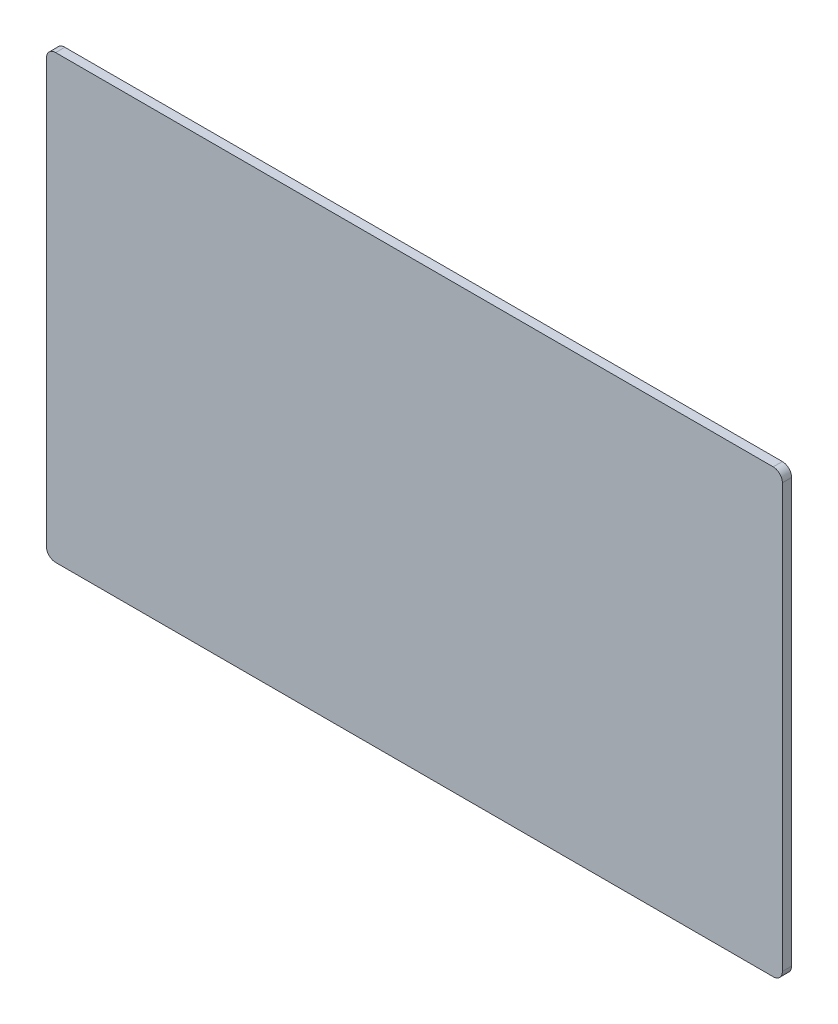
ISO-10303-21;
HEADER;
FILE_DESCRIPTION(('STEP AP214'),'2;1');
FILE_NAME('part.step','',(''),(''),'','','');
FILE_SCHEMA(('AUTOMOTIVE_DESIGN { 1 0 10303 214 1 1 1 1 }'));
ENDSEC;
DATA;
#1=APPLICATION_CONTEXT('core data for automotive mechanical design processes');
#2=APPLICATION_PROTOCOL_DEFINITION('international standard','automotive_design',2000,#1);
#3=PRODUCT_CONTEXT('',#1,'mechanical');
#4=PRODUCT('Part','Part','',(#3));
#5=PRODUCT_RELATED_PRODUCT_CATEGORY('part','',(#4));
#6=PRODUCT_DEFINITION_FORMATION('','',#4);
#7=PRODUCT_DEFINITION_CONTEXT('part definition',#1,'design');
#8=PRODUCT_DEFINITION('design','',#6,#7);
#9=PRODUCT_DEFINITION_SHAPE('','',#8);
#10=(LENGTH_UNIT() NAMED_UNIT(*) SI_UNIT(.MILLI.,.METRE.));
#11=(NAMED_UNIT(*) PLANE_ANGLE_UNIT() SI_UNIT($,.RADIAN.));
#12=(NAMED_UNIT(*) SI_UNIT($,.STERADIAN.) SOLID_ANGLE_UNIT());
#13=UNCERTAINTY_MEASURE_WITH_UNIT(LENGTH_MEASURE(1.E-05),#10,'distance_accuracy_value','');
#14=(GEOMETRIC_REPRESENTATION_CONTEXT(3) GLOBAL_UNCERTAINTY_ASSIGNED_CONTEXT((#13)) GLOBAL_UNIT_ASSIGNED_CONTEXT((#10,
#11,#12)) REPRESENTATION_CONTEXT('',''));
#15=CARTESIAN_POINT('',(0.,0.,0.));
#16=DIRECTION('',(0.,0.,1.));
#17=DIRECTION('',(1.,0.,0.));
#18=AXIS2_PLACEMENT_3D('',#15,#16,#17);
#19=CARTESIAN_POINT('',(0.,0.,6.35));
#20=DIRECTION('',(1.,0.,0.));
#21=DIRECTION('',(0.,0.,-1.));
#22=AXIS2_PLACEMENT_3D('',#19,#20,#21);
#23=PLANE('',#22);
#24=DIRECTION('',(0.,-1.,0.));
#25=VECTOR('',#24,1.);
#26=CARTESIAN_POINT('',(0.,0.,6.35));
#27=LINE('',#26,#25);
#28=CARTESIAN_POINT('',(0.,298.45,6.35));
#29=VERTEX_POINT('',#28);
#30=CARTESIAN_POINT('',(0.,6.35,6.35));
#31=VERTEX_POINT('',#30);
#32=EDGE_CURVE('E128',#29,#31,#27,.T.);
#33=ORIENTED_EDGE('',*,*,#32,.F.);
#34=DIRECTION('',(0.,0.,-1.));
#35=VECTOR('',#34,1.);
#36=CARTESIAN_POINT('',(0.,298.45,6.35));
#37=LINE('',#36,#35);
#38=CARTESIAN_POINT('',(0.,298.45,0.));
#39=VERTEX_POINT('',#38);
#40=EDGE_CURVE('E113',#29,#39,#37,.T.);
#41=ORIENTED_EDGE('',*,*,#40,.T.);
#42=DIRECTION('',(0.,-1.,0.));
#43=VECTOR('',#42,1.);
#44=CARTESIAN_POINT('',(0.,0.,0.));
#45=LINE('',#44,#43);
#46=CARTESIAN_POINT('',(0.,6.35,0.));
#47=VERTEX_POINT('',#46);
#48=EDGE_CURVE('E125',#39,#47,#45,.T.);
#49=ORIENTED_EDGE('',*,*,#48,.T.);
#50=DIRECTION('',(0.,0.,-1.));
#51=VECTOR('',#50,1.);
#52=CARTESIAN_POINT('',(0.,6.35,6.35));
#53=LINE('',#52,#51);
#54=EDGE_CURVE('E130',#47,#31,#53,.F.);
#55=ORIENTED_EDGE('',*,*,#54,.T.);
#56=EDGE_LOOP('',(#33,#41,#49,#55));
#57=FACE_BOUND('',#56,.T.);
#58=ADVANCED_FACE('F43',(#57),#23,.F.);
#59=CARTESIAN_POINT('',(0.,0.,6.35));
#60=DIRECTION('',(0.,1.,0.));
#61=DIRECTION('',(0.,0.,1.));
#62=AXIS2_PLACEMENT_3D('',#59,#60,#61);
#63=PLANE('',#62);
#64=DIRECTION('',(1.,0.,0.));
#65=VECTOR('',#64,1.);
#66=CARTESIAN_POINT('',(0.,0.,0.));
#67=LINE('',#66,#65);
#68=CARTESIAN_POINT('',(6.35,0.,0.));
#69=VERTEX_POINT('',#68);
#70=CARTESIAN_POINT('',(501.65,0.,0.));
#71=VERTEX_POINT('',#70);
#72=EDGE_CURVE('E135',#69,#71,#67,.T.);
#73=ORIENTED_EDGE('',*,*,#72,.T.);
#74=DIRECTION('',(0.,0.,-1.));
#75=VECTOR('',#74,1.);
#76=CARTESIAN_POINT('',(501.65,0.,6.35));
#77=LINE('',#76,#75);
#78=CARTESIAN_POINT('',(501.65,0.,6.35));
#79=VERTEX_POINT('',#78);
#80=EDGE_CURVE('E11',#71,#79,#77,.F.);
#81=ORIENTED_EDGE('',*,*,#80,.T.);
#82=DIRECTION('',(1.,0.,0.));
#83=VECTOR('',#82,1.);
#84=CARTESIAN_POINT('',(0.,0.,6.35));
#85=LINE('',#84,#83);
#86=CARTESIAN_POINT('',(6.35,0.,6.35));
#87=VERTEX_POINT('',#86);
#88=EDGE_CURVE('E170',#87,#79,#85,.T.);
#89=ORIENTED_EDGE('',*,*,#88,.F.);
#90=DIRECTION('',(0.,0.,-1.));
#91=VECTOR('',#90,1.);
#92=CARTESIAN_POINT('',(6.35,0.,6.35));
#93=LINE('',#92,#91);
#94=EDGE_CURVE('E51',#87,#69,#93,.T.);
#95=ORIENTED_EDGE('',*,*,#94,.T.);
#96=EDGE_LOOP('',(#73,#81,#89,#95));
#97=FACE_BOUND('',#96,.T.);
#98=ADVANCED_FACE('F168',(#97),#63,.F.);
#99=CARTESIAN_POINT('',(508.,0.,6.35));
#100=DIRECTION('',(-1.,0.,0.));
#101=DIRECTION('',(0.,0.,1.));
#102=AXIS2_PLACEMENT_3D('',#99,#100,#101);
#103=PLANE('',#102);
#104=DIRECTION('',(0.,1.,0.));
#105=VECTOR('',#104,1.);
#106=CARTESIAN_POINT('',(508.,0.,6.35));
#107=LINE('',#106,#105);
#108=CARTESIAN_POINT('',(508.,6.35,6.35));
#109=VERTEX_POINT('',#108);
#110=CARTESIAN_POINT('',(508.,298.45,6.35));
#111=VERTEX_POINT('',#110);
#112=EDGE_CURVE('E178',#109,#111,#107,.T.);
#113=ORIENTED_EDGE('',*,*,#112,.F.);
#114=DIRECTION('',(0.,0.,-1.));
#115=VECTOR('',#114,1.);
#116=CARTESIAN_POINT('',(508.,6.35,6.35));
#117=LINE('',#116,#115);
#118=CARTESIAN_POINT('',(508.,6.35,0.));
#119=VERTEX_POINT('',#118);
#120=EDGE_CURVE('E162',#109,#119,#117,.T.);
#121=ORIENTED_EDGE('',*,*,#120,.T.);
#122=DIRECTION('',(0.,1.,0.));
#123=VECTOR('',#122,1.);
#124=CARTESIAN_POINT('',(508.,0.,0.));
#125=LINE('',#124,#123);
#126=CARTESIAN_POINT('',(508.,298.45,0.));
#127=VERTEX_POINT('',#126);
#128=EDGE_CURVE('E138',#119,#127,#125,.T.);
#129=ORIENTED_EDGE('',*,*,#128,.T.);
#130=DIRECTION('',(0.,0.,-1.));
#131=VECTOR('',#130,1.);
#132=CARTESIAN_POINT('',(508.,298.45,6.35));
#133=LINE('',#132,#131);
#134=EDGE_CURVE('E58',#127,#111,#133,.F.);
#135=ORIENTED_EDGE('',*,*,#134,.T.);
#136=EDGE_LOOP('',(#113,#121,#129,#135));
#137=FACE_BOUND('',#136,.T.);
#138=ADVANCED_FACE('F177',(#137),#103,.F.);
#139=CARTESIAN_POINT('',(0.,304.8,6.35));
#140=DIRECTION('',(0.,-1.,0.));
#141=DIRECTION('',(0.,0.,-1.));
#142=AXIS2_PLACEMENT_3D('',#139,#140,#141);
#143=PLANE('',#142);
#144=DIRECTION('',(-1.,0.,0.));
#145=VECTOR('',#144,1.);
#146=CARTESIAN_POINT('',(0.,304.8,0.));
#147=LINE('',#146,#145);
#148=CARTESIAN_POINT('',(501.65,304.8,0.));
#149=VERTEX_POINT('',#148);
#150=CARTESIAN_POINT('',(6.35,304.8,0.));
#151=VERTEX_POINT('',#150);
#152=EDGE_CURVE('E145',#149,#151,#147,.T.);
#153=ORIENTED_EDGE('',*,*,#152,.T.);
#154=DIRECTION('',(0.,0.,-1.));
#155=VECTOR('',#154,1.);
#156=CARTESIAN_POINT('',(6.35,304.8,6.35));
#157=LINE('',#156,#155);
#158=CARTESIAN_POINT('',(6.35,304.8,6.35));
#159=VERTEX_POINT('',#158);
#160=EDGE_CURVE('E114',#151,#159,#157,.F.);
#161=ORIENTED_EDGE('',*,*,#160,.T.);
#162=DIRECTION('',(-1.,0.,0.));
#163=VECTOR('',#162,1.);
#164=CARTESIAN_POINT('',(0.,304.8,6.35));
#165=LINE('',#164,#163);
#166=CARTESIAN_POINT('',(501.65,304.8,6.35));
#167=VERTEX_POINT('',#166);
#168=EDGE_CURVE('E141',#167,#159,#165,.T.);
#169=ORIENTED_EDGE('',*,*,#168,.F.);
#170=DIRECTION('',(0.,0.,-1.));
#171=VECTOR('',#170,1.);
#172=CARTESIAN_POINT('',(501.65,304.8,6.35));
#173=LINE('',#172,#171);
#174=EDGE_CURVE('E119',#167,#149,#173,.T.);
#175=ORIENTED_EDGE('',*,*,#174,.T.);
#176=EDGE_LOOP('',(#153,#161,#169,#175));
#177=FACE_BOUND('',#176,.T.);
#178=ADVANCED_FACE('F208',(#177),#143,.F.);
#179=CARTESIAN_POINT('',(0.,0.,6.35));
#180=DIRECTION('',(0.,0.,-1.));
#181=DIRECTION('',(-1.,0.,0.));
#182=AXIS2_PLACEMENT_3D('',#179,#180,#181);
#183=PLANE('',#182);
#184=ORIENTED_EDGE('',*,*,#168,.T.);
#185=CARTESIAN_POINT('',(6.35,298.45,6.35));
#186=DIRECTION('',(0.,0.,-1.));
#187=DIRECTION('',(-1.,0.,0.));
#188=AXIS2_PLACEMENT_3D('',#185,#186,#187);
#189=CIRCLE('',#188,6.35);
#190=EDGE_CURVE('E159',#159,#29,#189,.F.);
#191=ORIENTED_EDGE('',*,*,#190,.T.);
#192=ORIENTED_EDGE('',*,*,#32,.T.);
#193=CARTESIAN_POINT('',(6.35,6.35,6.35));
#194=DIRECTION('',(0.,0.,-1.));
#195=DIRECTION('',(-1.,0.,0.));
#196=AXIS2_PLACEMENT_3D('',#193,#194,#195);
#197=CIRCLE('',#196,6.35);
#198=EDGE_CURVE('E156',#31,#87,#197,.F.);
#199=ORIENTED_EDGE('',*,*,#198,.T.);
#200=ORIENTED_EDGE('',*,*,#88,.T.);
#201=CARTESIAN_POINT('',(501.65,6.35,6.35));
#202=DIRECTION('',(0.,0.,-1.));
#203=DIRECTION('',(-1.,0.,0.));
#204=AXIS2_PLACEMENT_3D('',#201,#202,#203);
#205=CIRCLE('',#204,6.35);
#206=EDGE_CURVE('E65',#79,#109,#205,.F.);
#207=ORIENTED_EDGE('',*,*,#206,.T.);
#208=ORIENTED_EDGE('',*,*,#112,.T.);
#209=CARTESIAN_POINT('',(501.65,298.45,6.35));
#210=DIRECTION('',(0.,0.,-1.));
#211=DIRECTION('',(-1.,0.,0.));
#212=AXIS2_PLACEMENT_3D('',#209,#210,#211);
#213=CIRCLE('',#212,6.35);
#214=EDGE_CURVE('E154',#111,#167,#213,.F.);
#215=ORIENTED_EDGE('',*,*,#214,.T.);
#216=EDGE_LOOP('',(#184,#191,#192,#199,#200,#207,#208,#215));
#217=FACE_BOUND('',#216,.T.);
#218=ADVANCED_FACE('F183',(#217),#183,.F.);
#219=CARTESIAN_POINT('',(0.,0.,0.));
#220=DIRECTION('',(0.,0.,-1.));
#221=DIRECTION('',(-1.,0.,0.));
#222=AXIS2_PLACEMENT_3D('',#219,#220,#221);
#223=PLANE('',#222);
#224=ORIENTED_EDGE('',*,*,#48,.F.);
#225=CARTESIAN_POINT('',(6.35,298.45,0.));
#226=DIRECTION('',(0.,0.,-1.));
#227=DIRECTION('',(-1.,0.,0.));
#228=AXIS2_PLACEMENT_3D('',#225,#226,#227);
#229=CIRCLE('',#228,6.35);
#230=EDGE_CURVE('E109',#39,#151,#229,.T.);
#231=ORIENTED_EDGE('',*,*,#230,.T.);
#232=ORIENTED_EDGE('',*,*,#152,.F.);
#233=CARTESIAN_POINT('',(501.65,298.45,0.));
#234=DIRECTION('',(0.,0.,-1.));
#235=DIRECTION('',(-1.,0.,0.));
#236=AXIS2_PLACEMENT_3D('',#233,#234,#235);
#237=CIRCLE('',#236,6.35);
#238=EDGE_CURVE('E129',#149,#127,#237,.T.);
#239=ORIENTED_EDGE('',*,*,#238,.T.);
#240=ORIENTED_EDGE('',*,*,#128,.F.);
#241=CARTESIAN_POINT('',(501.65,6.35,0.));
#242=DIRECTION('',(0.,0.,-1.));
#243=DIRECTION('',(-1.,0.,0.));
#244=AXIS2_PLACEMENT_3D('',#241,#242,#243);
#245=CIRCLE('',#244,6.35);
#246=EDGE_CURVE('E120',#119,#71,#245,.T.);
#247=ORIENTED_EDGE('',*,*,#246,.T.);
#248=ORIENTED_EDGE('',*,*,#72,.F.);
#249=CARTESIAN_POINT('',(6.35,6.35,0.));
#250=DIRECTION('',(0.,0.,-1.));
#251=DIRECTION('',(-1.,0.,0.));
#252=AXIS2_PLACEMENT_3D('',#249,#250,#251);
#253=CIRCLE('',#252,6.35);
#254=EDGE_CURVE('E134',#69,#47,#253,.T.);
#255=ORIENTED_EDGE('',*,*,#254,.T.);
#256=EDGE_LOOP('',(#224,#231,#232,#239,#240,#247,#248,#255));
#257=FACE_BOUND('',#256,.T.);
#258=ADVANCED_FACE('F132',(#257),#223,.T.);
#259=CARTESIAN_POINT('',(6.35,298.45,6.35));
#260=DIRECTION('',(0.,0.,-1.));
#261=DIRECTION('',(-1.,0.,0.));
#262=AXIS2_PLACEMENT_3D('',#259,#260,#261);
#263=CYLINDRICAL_SURFACE('',#262,6.35);
#264=ORIENTED_EDGE('',*,*,#190,.F.);
#265=ORIENTED_EDGE('',*,*,#160,.F.);
#266=ORIENTED_EDGE('',*,*,#230,.F.);
#267=ORIENTED_EDGE('',*,*,#40,.F.);
#268=EDGE_LOOP('',(#264,#265,#266,#267));
#269=FACE_BOUND('',#268,.T.);
#270=ADVANCED_FACE('F112',(#269),#263,.T.);
#271=CARTESIAN_POINT('',(501.65,6.35,6.35));
#272=DIRECTION('',(0.,0.,-1.));
#273=DIRECTION('',(-1.,0.,0.));
#274=AXIS2_PLACEMENT_3D('',#271,#272,#273);
#275=CYLINDRICAL_SURFACE('',#274,6.35);
#276=ORIENTED_EDGE('',*,*,#206,.F.);
#277=ORIENTED_EDGE('',*,*,#80,.F.);
#278=ORIENTED_EDGE('',*,*,#246,.F.);
#279=ORIENTED_EDGE('',*,*,#120,.F.);
#280=EDGE_LOOP('',(#276,#277,#278,#279));
#281=FACE_BOUND('',#280,.T.);
#282=ADVANCED_FACE('F176',(#281),#275,.T.);
#283=CARTESIAN_POINT('',(6.35,6.35,6.35));
#284=DIRECTION('',(0.,0.,-1.));
#285=DIRECTION('',(-1.,0.,0.));
#286=AXIS2_PLACEMENT_3D('',#283,#284,#285);
#287=CYLINDRICAL_SURFACE('',#286,6.35);
#288=ORIENTED_EDGE('',*,*,#198,.F.);
#289=ORIENTED_EDGE('',*,*,#54,.F.);
#290=ORIENTED_EDGE('',*,*,#254,.F.);
#291=ORIENTED_EDGE('',*,*,#94,.F.);
#292=EDGE_LOOP('',(#288,#289,#290,#291));
#293=FACE_BOUND('',#292,.T.);
#294=ADVANCED_FACE('F184',(#293),#287,.T.);
#295=CARTESIAN_POINT('',(501.65,298.45,6.35));
#296=DIRECTION('',(0.,0.,-1.));
#297=DIRECTION('',(-1.,0.,0.));
#298=AXIS2_PLACEMENT_3D('',#295,#296,#297);
#299=CYLINDRICAL_SURFACE('',#298,6.35);
#300=ORIENTED_EDGE('',*,*,#214,.F.);
#301=ORIENTED_EDGE('',*,*,#134,.F.);
#302=ORIENTED_EDGE('',*,*,#238,.F.);
#303=ORIENTED_EDGE('',*,*,#174,.F.);
#304=EDGE_LOOP('',(#300,#301,#302,#303));
#305=FACE_BOUND('',#304,.T.);
#306=ADVANCED_FACE('F45',(#305),#299,.T.);
#307=CLOSED_SHELL('',(#58,#98,#138,#178,#218,#258,#270,#282,#294,#306));
#308=MANIFOLD_SOLID_BREP('B2',#307);
#309=ADVANCED_BREP_SHAPE_REPRESENTATION('',(#18,#308),#14);
#310=SHAPE_DEFINITION_REPRESENTATION(#9,#309);
ENDSEC;
END-ISO-10303-21;
